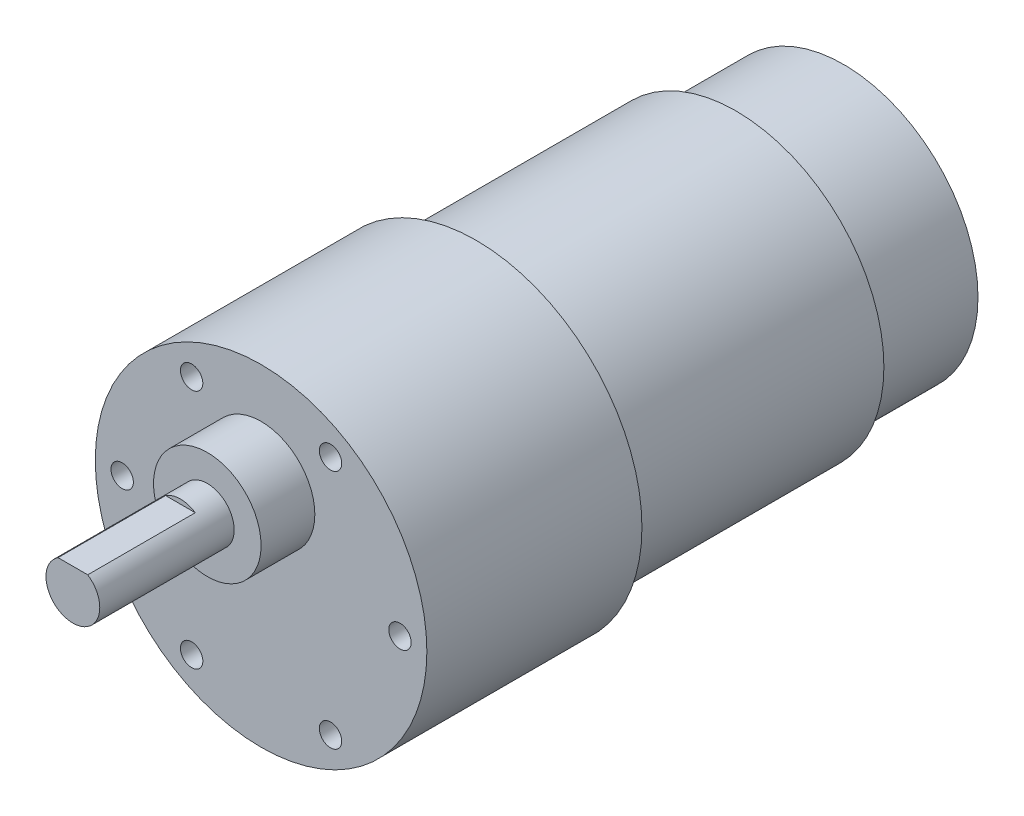
ISO-10303-21;
HEADER;
FILE_DESCRIPTION(('STEP AP214'),'2;1');
FILE_NAME('part.step','',(''),(''),'','','');
FILE_SCHEMA(('AUTOMOTIVE_DESIGN { 1 0 10303 214 1 1 1 1 }'));
ENDSEC;
DATA;
#1=APPLICATION_CONTEXT('core data for automotive mechanical design processes');
#2=APPLICATION_PROTOCOL_DEFINITION('international standard','automotive_design',2000,#1);
#3=PRODUCT_CONTEXT('',#1,'mechanical');
#4=PRODUCT('Part','Part','',(#3));
#5=PRODUCT_RELATED_PRODUCT_CATEGORY('part','',(#4));
#6=PRODUCT_DEFINITION_FORMATION('','',#4);
#7=PRODUCT_DEFINITION_CONTEXT('part definition',#1,'design');
#8=PRODUCT_DEFINITION('design','',#6,#7);
#9=PRODUCT_DEFINITION_SHAPE('','',#8);
#10=(LENGTH_UNIT() NAMED_UNIT(*) SI_UNIT(.MILLI.,.METRE.));
#11=(NAMED_UNIT(*) PLANE_ANGLE_UNIT() SI_UNIT($,.RADIAN.));
#12=(NAMED_UNIT(*) SI_UNIT($,.STERADIAN.) SOLID_ANGLE_UNIT());
#13=UNCERTAINTY_MEASURE_WITH_UNIT(LENGTH_MEASURE(1.E-05),#10,'distance_accuracy_value','');
#14=(GEOMETRIC_REPRESENTATION_CONTEXT(3) GLOBAL_UNCERTAINTY_ASSIGNED_CONTEXT((#13)) GLOBAL_UNIT_ASSIGNED_CONTEXT((#10,
#11,#12)) REPRESENTATION_CONTEXT('',''));
#15=CARTESIAN_POINT('',(0.,0.,0.));
#16=DIRECTION('',(0.,0.,1.));
#17=DIRECTION('',(1.,0.,0.));
#18=AXIS2_PLACEMENT_3D('',#15,#16,#17);
#19=CARTESIAN_POINT('',(0.,0.,21.));
#20=DIRECTION('',(0.,0.,-1.));
#21=DIRECTION('',(-1.,0.,0.));
#22=AXIS2_PLACEMENT_3D('',#19,#20,#21);
#23=CYLINDRICAL_SURFACE('',#22,3.);
#24=CARTESIAN_POINT('',(0.,0.,6.));
#25=DIRECTION('',(0.,0.,1.));
#26=DIRECTION('',(1.,0.,0.));
#27=AXIS2_PLACEMENT_3D('',#24,#25,#26);
#28=CIRCLE('',#27,3.);
#29=CARTESIAN_POINT('',(3.,0.,6.));
#30=VERTEX_POINT('',#29);
#31=EDGE_CURVE('E83',#30,#30,#28,.T.);
#32=ORIENTED_EDGE('',*,*,#31,.T.);
#33=EDGE_LOOP('',(#32));
#34=FACE_BOUND('',#33,.T.);
#35=DIRECTION('',(0.,0.,-1.));
#36=VECTOR('',#35,1.);
#37=CARTESIAN_POINT('',(1.6583123951777,2.5,21.));
#38=LINE('',#37,#36);
#39=CARTESIAN_POINT('',(1.6583123951777,2.5,21.));
#40=VERTEX_POINT('',#39);
#41=CARTESIAN_POINT('',(1.6583123951777,2.5,9.));
#42=VERTEX_POINT('',#41);
#43=EDGE_CURVE('E73',#40,#42,#38,.T.);
#44=ORIENTED_EDGE('',*,*,#43,.F.);
#45=CARTESIAN_POINT('',(0.,0.,21.));
#46=DIRECTION('',(0.,0.,1.));
#47=DIRECTION('',(1.,0.,0.));
#48=AXIS2_PLACEMENT_3D('',#45,#46,#47);
#49=CIRCLE('',#48,3.);
#50=CARTESIAN_POINT('',(-1.6583123951777,2.5,21.));
#51=VERTEX_POINT('',#50);
#52=EDGE_CURVE('E77',#51,#40,#49,.T.);
#53=ORIENTED_EDGE('',*,*,#52,.F.);
#54=DIRECTION('',(0.,0.,-1.));
#55=VECTOR('',#54,1.);
#56=CARTESIAN_POINT('',(-1.6583123951777,2.5,21.));
#57=LINE('',#56,#55);
#58=CARTESIAN_POINT('',(-1.6583123951777,2.5,9.));
#59=VERTEX_POINT('',#58);
#60=EDGE_CURVE('E58',#59,#51,#57,.F.);
#61=ORIENTED_EDGE('',*,*,#60,.F.);
#62=CARTESIAN_POINT('',(0.,0.,9.));
#63=DIRECTION('',(0.,0.,1.));
#64=DIRECTION('',(1.,0.,0.));
#65=AXIS2_PLACEMENT_3D('',#62,#63,#64);
#66=CIRCLE('',#65,3.);
#67=EDGE_CURVE('E11',#42,#59,#66,.T.);
#68=ORIENTED_EDGE('',*,*,#67,.F.);
#69=EDGE_LOOP('',(#44,#53,#61,#68));
#70=FACE_BOUND('',#69,.T.);
#71=ADVANCED_FACE('F43',(#34,#70),#23,.T.);
#72=CARTESIAN_POINT('',(0.,0.,21.));
#73=DIRECTION('',(0.,0.,1.));
#74=DIRECTION('',(1.,0.,0.));
#75=AXIS2_PLACEMENT_3D('',#72,#73,#74);
#76=PLANE('',#75);
#77=ORIENTED_EDGE('',*,*,#52,.T.);
#78=DIRECTION('',(-1.,0.,0.));
#79=VECTOR('',#78,1.);
#80=CARTESIAN_POINT('',(0.,2.5,21.));
#81=LINE('',#80,#79);
#82=EDGE_CURVE('E51',#40,#51,#81,.T.);
#83=ORIENTED_EDGE('',*,*,#82,.T.);
#84=EDGE_LOOP('',(#77,#83));
#85=FACE_BOUND('',#84,.T.);
#86=ADVANCED_FACE('F145',(#85),#76,.T.);
#87=CARTESIAN_POINT('',(0.,-7.,0.));
#88=DIRECTION('',(0.,0.,-1.));
#89=DIRECTION('',(-1.,0.,0.));
#90=AXIS2_PLACEMENT_3D('',#87,#88,#89);
#91=CYLINDRICAL_SURFACE('',#90,18.5);
#92=CARTESIAN_POINT('',(0.,-7.,0.));
#93=DIRECTION('',(0.,0.,1.));
#94=DIRECTION('',(1.,0.,0.));
#95=AXIS2_PLACEMENT_3D('',#92,#93,#94);
#96=CIRCLE('',#95,18.5);
#97=CARTESIAN_POINT('',(18.5,-7.,0.));
#98=VERTEX_POINT('',#97);
#99=EDGE_CURVE('E86',#98,#98,#96,.T.);
#100=ORIENTED_EDGE('',*,*,#99,.F.);
#101=EDGE_LOOP('',(#100));
#102=FACE_BOUND('',#101,.T.);
#103=CARTESIAN_POINT('',(0.,-7.,-24.));
#104=DIRECTION('',(0.,0.,1.));
#105=DIRECTION('',(1.,0.,0.));
#106=AXIS2_PLACEMENT_3D('',#103,#104,#105);
#107=CIRCLE('',#106,18.5);
#108=CARTESIAN_POINT('',(18.5,-7.,-24.));
#109=VERTEX_POINT('',#108);
#110=EDGE_CURVE('E125',#109,#109,#107,.T.);
#111=ORIENTED_EDGE('',*,*,#110,.T.);
#112=EDGE_LOOP('',(#111));
#113=FACE_BOUND('',#112,.T.);
#114=ADVANCED_FACE('F45',(#102,#113),#91,.T.);
#115=CARTESIAN_POINT('',(0.,-7.,0.));
#116=DIRECTION('',(0.,0.,1.));
#117=DIRECTION('',(1.,0.,0.));
#118=AXIS2_PLACEMENT_3D('',#115,#116,#117);
#119=PLANE('',#118);
#120=CARTESIAN_POINT('',(0.,0.,0.));
#121=DIRECTION('',(0.,0.,1.));
#122=DIRECTION('',(1.,0.,0.));
#123=AXIS2_PLACEMENT_3D('',#120,#121,#122);
#124=CIRCLE('',#123,6.);
#125=CARTESIAN_POINT('',(6.,0.,0.));
#126=VERTEX_POINT('',#125);
#127=EDGE_CURVE('E82',#126,#126,#124,.T.);
#128=ORIENTED_EDGE('',*,*,#127,.F.);
#129=EDGE_LOOP('',(#128));
#130=FACE_BOUND('',#129,.T.);
#131=CARTESIAN_POINT('',(15.5,-7.,0.));
#132=DIRECTION('',(0.,0.,1.));
#133=DIRECTION('',(1.,0.,0.));
#134=AXIS2_PLACEMENT_3D('',#131,#132,#133);
#135=CIRCLE('',#134,1.25);
#136=CARTESIAN_POINT('',(16.75,-7.,0.));
#137=VERTEX_POINT('',#136);
#138=EDGE_CURVE('E128',#137,#137,#135,.F.);
#139=ORIENTED_EDGE('',*,*,#138,.T.);
#140=EDGE_LOOP('',(#139));
#141=FACE_BOUND('',#140,.T.);
#142=CARTESIAN_POINT('',(7.75,-20.4233937586588,0.));
#143=DIRECTION('',(0.,0.,1.));
#144=DIRECTION('',(1.,0.,0.));
#145=AXIS2_PLACEMENT_3D('',#142,#143,#144);
#146=CIRCLE('',#145,1.25);
#147=CARTESIAN_POINT('',(9.,-20.4233937586588,0.));
#148=VERTEX_POINT('',#147);
#149=EDGE_CURVE('E140',#148,#148,#146,.F.);
#150=ORIENTED_EDGE('',*,*,#149,.T.);
#151=EDGE_LOOP('',(#150));
#152=FACE_BOUND('',#151,.T.);
#153=CARTESIAN_POINT('',(-7.75000000000001,-20.4233937586588,0.));
#154=DIRECTION('',(0.,0.,1.));
#155=DIRECTION('',(1.,0.,0.));
#156=AXIS2_PLACEMENT_3D('',#153,#154,#155);
#157=CIRCLE('',#156,1.25);
#158=CARTESIAN_POINT('',(-6.50000000000001,-20.4233937586588,0.));
#159=VERTEX_POINT('',#158);
#160=EDGE_CURVE('E137',#159,#159,#157,.F.);
#161=ORIENTED_EDGE('',*,*,#160,.T.);
#162=EDGE_LOOP('',(#161));
#163=FACE_BOUND('',#162,.T.);
#164=CARTESIAN_POINT('',(-15.5,-7.,0.));
#165=DIRECTION('',(0.,0.,1.));
#166=DIRECTION('',(1.,0.,0.));
#167=AXIS2_PLACEMENT_3D('',#164,#165,#166);
#168=CIRCLE('',#167,1.25);
#169=CARTESIAN_POINT('',(-14.25,-7.,0.));
#170=VERTEX_POINT('',#169);
#171=EDGE_CURVE('E134',#170,#170,#168,.F.);
#172=ORIENTED_EDGE('',*,*,#171,.T.);
#173=EDGE_LOOP('',(#172));
#174=FACE_BOUND('',#173,.T.);
#175=CARTESIAN_POINT('',(-7.75,6.4233937586588,0.));
#176=DIRECTION('',(0.,0.,1.));
#177=DIRECTION('',(1.,0.,0.));
#178=AXIS2_PLACEMENT_3D('',#175,#176,#177);
#179=CIRCLE('',#178,1.25);
#180=CARTESIAN_POINT('',(-6.5,6.4233937586588,0.));
#181=VERTEX_POINT('',#180);
#182=EDGE_CURVE('E131',#181,#181,#179,.F.);
#183=ORIENTED_EDGE('',*,*,#182,.T.);
#184=EDGE_LOOP('',(#183));
#185=FACE_BOUND('',#184,.T.);
#186=CARTESIAN_POINT('',(7.75,6.4233937586588,0.));
#187=DIRECTION('',(0.,0.,1.));
#188=DIRECTION('',(1.,0.,0.));
#189=AXIS2_PLACEMENT_3D('',#186,#187,#188);
#190=CIRCLE('',#189,1.25);
#191=CARTESIAN_POINT('',(9.,6.4233937586588,0.));
#192=VERTEX_POINT('',#191);
#193=EDGE_CURVE('E108',#192,#192,#190,.F.);
#194=ORIENTED_EDGE('',*,*,#193,.T.);
#195=EDGE_LOOP('',(#194));
#196=FACE_BOUND('',#195,.T.);
#197=ORIENTED_EDGE('',*,*,#99,.T.);
#198=EDGE_LOOP('',(#197));
#199=FACE_BOUND('',#198,.T.);
#200=ADVANCED_FACE('F153',(#130,#141,#152,#163,#174,#185,#196,#199),#119,.T.);
#201=CARTESIAN_POINT('',(0.,-7.,-24.));
#202=DIRECTION('',(0.,0.,1.));
#203=DIRECTION('',(1.,0.,0.));
#204=AXIS2_PLACEMENT_3D('',#201,#202,#203);
#205=PLANE('',#204);
#206=CARTESIAN_POINT('',(0.,-7.,-24.));
#207=DIRECTION('',(0.,0.,1.));
#208=DIRECTION('',(1.,0.,0.));
#209=AXIS2_PLACEMENT_3D('',#206,#207,#208);
#210=CIRCLE('',#209,16.5);
#211=CARTESIAN_POINT('',(-16.5,-7.,-24.));
#212=VERTEX_POINT('',#211);
#213=EDGE_CURVE('E99',#212,#212,#210,.T.);
#214=ORIENTED_EDGE('',*,*,#213,.T.);
#215=EDGE_LOOP('',(#214));
#216=FACE_BOUND('',#215,.T.);
#217=ORIENTED_EDGE('',*,*,#110,.F.);
#218=EDGE_LOOP('',(#217));
#219=FACE_BOUND('',#218,.T.);
#220=ADVANCED_FACE('F205',(#216,#219),#205,.F.);
#221=CARTESIAN_POINT('',(7.75,6.4233937586588,0.00999999999999959));
#222=DIRECTION('',(0.,0.,-1.));
#223=DIRECTION('',(-1.,0.,0.));
#224=AXIS2_PLACEMENT_3D('',#221,#222,#223);
#225=CYLINDRICAL_SURFACE('',#224,1.25);
#226=ORIENTED_EDGE('',*,*,#193,.F.);
#227=EDGE_LOOP('',(#226));
#228=FACE_BOUND('',#227,.T.);
#229=CARTESIAN_POINT('',(7.75,6.4233937586588,-3.5));
#230=DIRECTION('',(0.,0.,1.));
#231=DIRECTION('',(1.,0.,0.));
#232=AXIS2_PLACEMENT_3D('',#229,#230,#231);
#233=CIRCLE('',#232,1.25);
#234=CARTESIAN_POINT('',(9.,6.4233937586588,-3.5));
#235=VERTEX_POINT('',#234);
#236=EDGE_CURVE('E109',#235,#235,#233,.T.);
#237=ORIENTED_EDGE('',*,*,#236,.F.);
#238=EDGE_LOOP('',(#237));
#239=FACE_BOUND('',#238,.T.);
#240=ADVANCED_FACE('F201',(#228,#239),#225,.F.);
#241=CARTESIAN_POINT('',(7.75,6.4233937586588,-3.5));
#242=DIRECTION('',(0.,0.,1.));
#243=DIRECTION('',(1.,0.,0.));
#244=AXIS2_PLACEMENT_3D('',#241,#242,#243);
#245=PLANE('',#244);
#246=ORIENTED_EDGE('',*,*,#236,.T.);
#247=EDGE_LOOP('',(#246));
#248=FACE_BOUND('',#247,.T.);
#249=ADVANCED_FACE('F204',(#248),#245,.T.);
#250=CARTESIAN_POINT('',(-7.75,6.4233937586588,0.00999999999999959));
#251=DIRECTION('',(0.,0.,-1.));
#252=DIRECTION('',(-1.,0.,0.));
#253=AXIS2_PLACEMENT_3D('',#250,#251,#252);
#254=CYLINDRICAL_SURFACE('',#253,1.25);
#255=ORIENTED_EDGE('',*,*,#182,.F.);
#256=EDGE_LOOP('',(#255));
#257=FACE_BOUND('',#256,.T.);
#258=CARTESIAN_POINT('',(-7.75,6.4233937586588,-3.5));
#259=DIRECTION('',(0.,0.,1.));
#260=DIRECTION('',(1.,0.,0.));
#261=AXIS2_PLACEMENT_3D('',#258,#259,#260);
#262=CIRCLE('',#261,1.25);
#263=CARTESIAN_POINT('',(-6.5,6.4233937586588,-3.5));
#264=VERTEX_POINT('',#263);
#265=EDGE_CURVE('E115',#264,#264,#262,.T.);
#266=ORIENTED_EDGE('',*,*,#265,.F.);
#267=EDGE_LOOP('',(#266));
#268=FACE_BOUND('',#267,.T.);
#269=ADVANCED_FACE('F209',(#257,#268),#254,.F.);
#270=CARTESIAN_POINT('',(-7.75,6.4233937586588,-3.5));
#271=DIRECTION('',(0.,0.,1.));
#272=DIRECTION('',(1.,0.,0.));
#273=AXIS2_PLACEMENT_3D('',#270,#271,#272);
#274=PLANE('',#273);
#275=ORIENTED_EDGE('',*,*,#265,.T.);
#276=EDGE_LOOP('',(#275));
#277=FACE_BOUND('',#276,.T.);
#278=ADVANCED_FACE('F213',(#277),#274,.T.);
#279=CARTESIAN_POINT('',(-15.5,-7.,0.00999999999999959));
#280=DIRECTION('',(0.,0.,-1.));
#281=DIRECTION('',(-1.,0.,0.));
#282=AXIS2_PLACEMENT_3D('',#279,#280,#281);
#283=CYLINDRICAL_SURFACE('',#282,1.25);
#284=ORIENTED_EDGE('',*,*,#171,.F.);
#285=EDGE_LOOP('',(#284));
#286=FACE_BOUND('',#285,.T.);
#287=CARTESIAN_POINT('',(-15.5,-7.,-3.5));
#288=DIRECTION('',(0.,0.,1.));
#289=DIRECTION('',(1.,0.,0.));
#290=AXIS2_PLACEMENT_3D('',#287,#288,#289);
#291=CIRCLE('',#290,1.25);
#292=CARTESIAN_POINT('',(-14.25,-7.,-3.5));
#293=VERTEX_POINT('',#292);
#294=EDGE_CURVE('E118',#293,#293,#291,.T.);
#295=ORIENTED_EDGE('',*,*,#294,.F.);
#296=EDGE_LOOP('',(#295));
#297=FACE_BOUND('',#296,.T.);
#298=ADVANCED_FACE('F217',(#286,#297),#283,.F.);
#299=CARTESIAN_POINT('',(-15.5,-7.,-3.5));
#300=DIRECTION('',(0.,0.,1.));
#301=DIRECTION('',(1.,0.,0.));
#302=AXIS2_PLACEMENT_3D('',#299,#300,#301);
#303=PLANE('',#302);
#304=ORIENTED_EDGE('',*,*,#294,.T.);
#305=EDGE_LOOP('',(#304));
#306=FACE_BOUND('',#305,.T.);
#307=ADVANCED_FACE('F221',(#306),#303,.T.);
#308=CARTESIAN_POINT('',(-7.75000000000001,-20.4233937586588,0.00999999999999959));
#309=DIRECTION('',(0.,0.,-1.));
#310=DIRECTION('',(-1.,0.,0.));
#311=AXIS2_PLACEMENT_3D('',#308,#309,#310);
#312=CYLINDRICAL_SURFACE('',#311,1.25);
#313=ORIENTED_EDGE('',*,*,#160,.F.);
#314=EDGE_LOOP('',(#313));
#315=FACE_BOUND('',#314,.T.);
#316=CARTESIAN_POINT('',(-7.75000000000001,-20.4233937586588,-3.5));
#317=DIRECTION('',(0.,0.,1.));
#318=DIRECTION('',(1.,0.,0.));
#319=AXIS2_PLACEMENT_3D('',#316,#317,#318);
#320=CIRCLE('',#319,1.25);
#321=CARTESIAN_POINT('',(-6.50000000000001,-20.4233937586588,-3.5));
#322=VERTEX_POINT('',#321);
#323=EDGE_CURVE('E112',#322,#322,#320,.T.);
#324=ORIENTED_EDGE('',*,*,#323,.F.);
#325=EDGE_LOOP('',(#324));
#326=FACE_BOUND('',#325,.T.);
#327=ADVANCED_FACE('F225',(#315,#326),#312,.F.);
#328=CARTESIAN_POINT('',(-7.75000000000001,-20.4233937586588,-3.5));
#329=DIRECTION('',(0.,0.,1.));
#330=DIRECTION('',(1.,0.,0.));
#331=AXIS2_PLACEMENT_3D('',#328,#329,#330);
#332=PLANE('',#331);
#333=ORIENTED_EDGE('',*,*,#323,.T.);
#334=EDGE_LOOP('',(#333));
#335=FACE_BOUND('',#334,.T.);
#336=ADVANCED_FACE('F196',(#335),#332,.T.);
#337=CARTESIAN_POINT('',(7.75,-20.4233937586588,0.00999999999999959));
#338=DIRECTION('',(0.,0.,-1.));
#339=DIRECTION('',(-1.,0.,0.));
#340=AXIS2_PLACEMENT_3D('',#337,#338,#339);
#341=CYLINDRICAL_SURFACE('',#340,1.25);
#342=ORIENTED_EDGE('',*,*,#149,.F.);
#343=EDGE_LOOP('',(#342));
#344=FACE_BOUND('',#343,.T.);
#345=CARTESIAN_POINT('',(7.75,-20.4233937586588,-3.5));
#346=DIRECTION('',(0.,0.,1.));
#347=DIRECTION('',(1.,0.,0.));
#348=AXIS2_PLACEMENT_3D('',#345,#346,#347);
#349=CIRCLE('',#348,1.25);
#350=CARTESIAN_POINT('',(9.,-20.4233937586588,-3.5));
#351=VERTEX_POINT('',#350);
#352=EDGE_CURVE('E102',#351,#351,#349,.T.);
#353=ORIENTED_EDGE('',*,*,#352,.F.);
#354=EDGE_LOOP('',(#353));
#355=FACE_BOUND('',#354,.T.);
#356=ADVANCED_FACE('F193',(#344,#355),#341,.F.);
#357=CARTESIAN_POINT('',(7.75,-20.4233937586588,-3.5));
#358=DIRECTION('',(0.,0.,1.));
#359=DIRECTION('',(1.,0.,0.));
#360=AXIS2_PLACEMENT_3D('',#357,#358,#359);
#361=PLANE('',#360);
#362=ORIENTED_EDGE('',*,*,#352,.T.);
#363=EDGE_LOOP('',(#362));
#364=FACE_BOUND('',#363,.T.);
#365=ADVANCED_FACE('F191',(#364),#361,.T.);
#366=CARTESIAN_POINT('',(15.5,-7.,0.00999999999999959));
#367=DIRECTION('',(0.,0.,-1.));
#368=DIRECTION('',(-1.,0.,0.));
#369=AXIS2_PLACEMENT_3D('',#366,#367,#368);
#370=CYLINDRICAL_SURFACE('',#369,1.25);
#371=ORIENTED_EDGE('',*,*,#138,.F.);
#372=EDGE_LOOP('',(#371));
#373=FACE_BOUND('',#372,.T.);
#374=CARTESIAN_POINT('',(15.5,-7.,-3.5));
#375=DIRECTION('',(0.,0.,1.));
#376=DIRECTION('',(1.,0.,0.));
#377=AXIS2_PLACEMENT_3D('',#374,#375,#376);
#378=CIRCLE('',#377,1.25);
#379=CARTESIAN_POINT('',(16.75,-7.,-3.5));
#380=VERTEX_POINT('',#379);
#381=EDGE_CURVE('E105',#380,#380,#378,.T.);
#382=ORIENTED_EDGE('',*,*,#381,.F.);
#383=EDGE_LOOP('',(#382));
#384=FACE_BOUND('',#383,.T.);
#385=ADVANCED_FACE('F187',(#373,#384),#370,.F.);
#386=CARTESIAN_POINT('',(15.5,-7.,-3.5));
#387=DIRECTION('',(0.,0.,1.));
#388=DIRECTION('',(1.,0.,0.));
#389=AXIS2_PLACEMENT_3D('',#386,#387,#388);
#390=PLANE('',#389);
#391=ORIENTED_EDGE('',*,*,#381,.T.);
#392=EDGE_LOOP('',(#391));
#393=FACE_BOUND('',#392,.T.);
#394=ADVANCED_FACE('F183',(#393),#390,.T.);
#395=CARTESIAN_POINT('',(0.,-7.,-24.));
#396=DIRECTION('',(0.,0.,-1.));
#397=DIRECTION('',(-1.,0.,0.));
#398=AXIS2_PLACEMENT_3D('',#395,#396,#397);
#399=CYLINDRICAL_SURFACE('',#398,16.5);
#400=CARTESIAN_POINT('',(0.,-7.,-53.));
#401=DIRECTION('',(0.,0.,1.));
#402=DIRECTION('',(1.,0.,0.));
#403=AXIS2_PLACEMENT_3D('',#400,#401,#402);
#404=CIRCLE('',#403,16.5);
#405=CARTESIAN_POINT('',(-16.5,-7.,-53.));
#406=VERTEX_POINT('',#405);
#407=EDGE_CURVE('E96',#406,#406,#404,.T.);
#408=CARTESIAN_POINT('',(-16.5,-7.,-24.));
#409=CARTESIAN_POINT('',(-16.5,-7.,-24.3020833333333));
#410=CARTESIAN_POINT('',(-16.5,-7.,-24.6041666666667));
#411=CARTESIAN_POINT('',(-16.5,-7.,-25.2083333333333));
#412=CARTESIAN_POINT('',(-16.5,-7.,-25.5104166666667));
#413=CARTESIAN_POINT('',(-16.5,-7.,-26.1145833333333));
#414=CARTESIAN_POINT('',(-16.5,-7.,-26.4166666666667));
#415=CARTESIAN_POINT('',(-16.5,-7.,-27.0208333333333));
#416=CARTESIAN_POINT('',(-16.5,-7.,-27.3229166666667));
#417=CARTESIAN_POINT('',(-16.5,-7.,-27.9270833333333));
#418=CARTESIAN_POINT('',(-16.5,-7.,-28.2291666666667));
#419=CARTESIAN_POINT('',(-16.5,-7.,-28.8333333333333));
#420=CARTESIAN_POINT('',(-16.5,-7.,-29.1354166666667));
#421=CARTESIAN_POINT('',(-16.5,-7.,-29.7395833333333));
#422=CARTESIAN_POINT('',(-16.5,-7.,-30.0416666666667));
#423=CARTESIAN_POINT('',(-16.5,-7.,-30.6458333333333));
#424=CARTESIAN_POINT('',(-16.5,-7.,-30.9479166666667));
#425=CARTESIAN_POINT('',(-16.5,-7.,-31.5520833333333));
#426=CARTESIAN_POINT('',(-16.5,-7.,-31.8541666666667));
#427=CARTESIAN_POINT('',(-16.5,-7.,-32.4583333333333));
#428=CARTESIAN_POINT('',(-16.5,-7.,-32.7604166666667));
#429=CARTESIAN_POINT('',(-16.5,-7.,-33.3645833333333));
#430=CARTESIAN_POINT('',(-16.5,-7.,-33.6666666666667));
#431=CARTESIAN_POINT('',(-16.5,-7.,-34.2708333333333));
#432=CARTESIAN_POINT('',(-16.5,-7.,-34.5729166666667));
#433=CARTESIAN_POINT('',(-16.5,-7.,-35.1770833333333));
#434=CARTESIAN_POINT('',(-16.5,-7.,-35.4791666666667));
#435=CARTESIAN_POINT('',(-16.5,-7.,-36.0833333333333));
#436=CARTESIAN_POINT('',(-16.5,-7.,-36.3854166666667));
#437=CARTESIAN_POINT('',(-16.5,-7.,-36.9895833333333));
#438=CARTESIAN_POINT('',(-16.5,-7.,-37.2916666666667));
#439=CARTESIAN_POINT('',(-16.5,-7.,-37.8958333333333));
#440=CARTESIAN_POINT('',(-16.5,-7.,-38.1979166666667));
#441=CARTESIAN_POINT('',(-16.5,-7.,-38.8020833333333));
#442=CARTESIAN_POINT('',(-16.5,-7.,-39.1041666666667));
#443=CARTESIAN_POINT('',(-16.5,-7.,-39.7083333333333));
#444=CARTESIAN_POINT('',(-16.5,-7.,-40.0104166666667));
#445=CARTESIAN_POINT('',(-16.5,-7.,-40.6145833333333));
#446=CARTESIAN_POINT('',(-16.5,-7.,-40.9166666666667));
#447=CARTESIAN_POINT('',(-16.5,-7.,-41.5208333333333));
#448=CARTESIAN_POINT('',(-16.5,-7.,-41.8229166666667));
#449=CARTESIAN_POINT('',(-16.5,-7.,-42.4270833333333));
#450=CARTESIAN_POINT('',(-16.5,-7.,-42.7291666666667));
#451=CARTESIAN_POINT('',(-16.5,-7.,-43.3333333333333));
#452=CARTESIAN_POINT('',(-16.5,-7.,-43.6354166666667));
#453=CARTESIAN_POINT('',(-16.5,-7.,-44.2395833333333));
#454=CARTESIAN_POINT('',(-16.5,-7.,-44.5416666666667));
#455=CARTESIAN_POINT('',(-16.5,-7.,-45.1458333333333));
#456=CARTESIAN_POINT('',(-16.5,-7.,-45.4479166666667));
#457=CARTESIAN_POINT('',(-16.5,-7.,-46.0520833333333));
#458=CARTESIAN_POINT('',(-16.5,-7.,-46.3541666666667));
#459=CARTESIAN_POINT('',(-16.5,-7.,-46.9583333333333));
#460=CARTESIAN_POINT('',(-16.5,-7.,-47.2604166666667));
#461=CARTESIAN_POINT('',(-16.5,-7.,-47.8645833333333));
#462=CARTESIAN_POINT('',(-16.5,-7.,-48.1666666666667));
#463=CARTESIAN_POINT('',(-16.5,-7.,-48.7708333333333));
#464=CARTESIAN_POINT('',(-16.5,-7.,-49.0729166666667));
#465=CARTESIAN_POINT('',(-16.5,-7.,-49.6770833333333));
#466=CARTESIAN_POINT('',(-16.5,-7.,-49.9791666666667));
#467=CARTESIAN_POINT('',(-16.5,-7.,-50.5833333333333));
#468=CARTESIAN_POINT('',(-16.5,-7.,-50.8854166666667));
#469=CARTESIAN_POINT('',(-16.5,-7.,-51.4895833333333));
#470=CARTESIAN_POINT('',(-16.5,-7.,-51.7916666666667));
#471=CARTESIAN_POINT('',(-16.5,-7.,-52.3958333333333));
#472=CARTESIAN_POINT('',(-16.5,-7.,-52.6979166666667));
#473=CARTESIAN_POINT('',(-16.5,-7.,-53.));
#474=B_SPLINE_CURVE_WITH_KNOTS('',3,(#408,#409,#410,#411,#412,#413,#414,#415,#416,#417,#418,
#419,#420,#421,#422,#423,#424,#425,#426,#427,#428,#429,#430,#431,#432,#433,#434,#435,#436,#437,
#438,#439,#440,#441,#442,#443,#444,#445,#446,#447,#448,#449,#450,#451,#452,#453,#454,#455,#456,
#457,#458,#459,#460,#461,#462,#463,#464,#465,#466,#467,#468,#469,#470,#471,#472,#473),
.UNSPECIFIED.,.F.,.F.,(4,2,2,2,2,2,2,2,2,2,2,2,2,2,2,2,2,2,2,2,2,2,2,2,2,2,2,2,2,2,2,2,4),(0.,
0.906250000000001,1.8125,2.71875,3.625,4.53125,5.4375,6.34375,7.25,8.15625,9.0625,9.96875,
10.875,11.78125,12.6875,13.59375,14.5,15.40625,16.3125,17.21875,18.125,19.03125,19.9375,
20.84375,21.75,22.65625,23.5625,24.46875,25.375,26.28125,27.1875,28.09375,29.),.UNSPECIFIED.);
#475=EDGE_CURVE('BSEAM179',#212,#406,#474,.T.);
#476=ORIENTED_EDGE('',*,*,#213,.F.);
#477=ORIENTED_EDGE('',*,*,#407,.T.);
#478=ORIENTED_EDGE('',*,*,#475,.T.);
#479=ORIENTED_EDGE('',*,*,#475,.F.);
#480=EDGE_LOOP('',(#476,#478,#477,#479));
#481=FACE_BOUND('',#480,.T.);
#482=ADVANCED_FACE('F179',(#481),#399,.T.);
#483=CARTESIAN_POINT('',(0.,-7.,-53.));
#484=DIRECTION('',(0.,0.,1.));
#485=DIRECTION('',(1.,0.,0.));
#486=AXIS2_PLACEMENT_3D('',#483,#484,#485);
#487=PLANE('',#486);
#488=CARTESIAN_POINT('',(0.,-7.,-53.));
#489=DIRECTION('',(0.,0.,1.));
#490=DIRECTION('',(1.,0.,0.));
#491=AXIS2_PLACEMENT_3D('',#488,#489,#490);
#492=CIRCLE('',#491,15.);
#493=CARTESIAN_POINT('',(15.,-7.,-53.));
#494=VERTEX_POINT('',#493);
#495=EDGE_CURVE('E93',#494,#494,#492,.T.);
#496=ORIENTED_EDGE('',*,*,#495,.T.);
#497=EDGE_LOOP('',(#496));
#498=FACE_BOUND('',#497,.T.);
#499=ORIENTED_EDGE('',*,*,#407,.F.);
#500=EDGE_LOOP('',(#499));
#501=FACE_BOUND('',#500,.T.);
#502=ADVANCED_FACE('F175',(#498,#501),#487,.F.);
#503=CARTESIAN_POINT('',(0.,-7.,-53.));
#504=DIRECTION('',(0.,0.,-1.));
#505=DIRECTION('',(-1.,0.,0.));
#506=AXIS2_PLACEMENT_3D('',#503,#504,#505);
#507=CYLINDRICAL_SURFACE('',#506,15.);
#508=ORIENTED_EDGE('',*,*,#495,.F.);
#509=EDGE_LOOP('',(#508));
#510=FACE_BOUND('',#509,.T.);
#511=CARTESIAN_POINT('',(0.,-7.,-65.));
#512=DIRECTION('',(0.,0.,1.));
#513=DIRECTION('',(1.,0.,0.));
#514=AXIS2_PLACEMENT_3D('',#511,#512,#513);
#515=CIRCLE('',#514,15.);
#516=CARTESIAN_POINT('',(15.,-7.,-65.));
#517=VERTEX_POINT('',#516);
#518=EDGE_CURVE('E90',#517,#517,#515,.T.);
#519=ORIENTED_EDGE('',*,*,#518,.T.);
#520=EDGE_LOOP('',(#519));
#521=FACE_BOUND('',#520,.T.);
#522=ADVANCED_FACE('F171',(#510,#521),#507,.T.);
#523=CARTESIAN_POINT('',(0.,-7.,-65.));
#524=DIRECTION('',(0.,0.,1.));
#525=DIRECTION('',(1.,0.,0.));
#526=AXIS2_PLACEMENT_3D('',#523,#524,#525);
#527=PLANE('',#526);
#528=ORIENTED_EDGE('',*,*,#518,.F.);
#529=EDGE_LOOP('',(#528));
#530=FACE_BOUND('',#529,.T.);
#531=ADVANCED_FACE('F167',(#530),#527,.F.);
#532=CARTESIAN_POINT('',(0.,0.,6.));
#533=DIRECTION('',(0.,0.,-1.));
#534=DIRECTION('',(-1.,0.,0.));
#535=AXIS2_PLACEMENT_3D('',#532,#533,#534);
#536=CYLINDRICAL_SURFACE('',#535,6.);
#537=CARTESIAN_POINT('',(0.,0.,6.));
#538=DIRECTION('',(0.,0.,1.));
#539=DIRECTION('',(1.,0.,0.));
#540=AXIS2_PLACEMENT_3D('',#537,#538,#539);
#541=CIRCLE('',#540,6.);
#542=CARTESIAN_POINT('',(6.,0.,6.));
#543=VERTEX_POINT('',#542);
#544=EDGE_CURVE('E87',#543,#543,#541,.T.);
#545=ORIENTED_EDGE('',*,*,#544,.F.);
#546=EDGE_LOOP('',(#545));
#547=FACE_BOUND('',#546,.T.);
#548=ORIENTED_EDGE('',*,*,#127,.T.);
#549=EDGE_LOOP('',(#548));
#550=FACE_BOUND('',#549,.T.);
#551=ADVANCED_FACE('F163',(#547,#550),#536,.T.);
#552=CARTESIAN_POINT('',(0.,0.,6.));
#553=DIRECTION('',(0.,0.,1.));
#554=DIRECTION('',(1.,0.,0.));
#555=AXIS2_PLACEMENT_3D('',#552,#553,#554);
#556=PLANE('',#555);
#557=ORIENTED_EDGE('',*,*,#31,.F.);
#558=EDGE_LOOP('',(#557));
#559=FACE_BOUND('',#558,.T.);
#560=ORIENTED_EDGE('',*,*,#544,.T.);
#561=EDGE_LOOP('',(#560));
#562=FACE_BOUND('',#561,.T.);
#563=ADVANCED_FACE('F160',(#559,#562),#556,.T.);
#564=CARTESIAN_POINT('',(0.,0.,9.));
#565=DIRECTION('',(0.,0.,1.));
#566=DIRECTION('',(1.,0.,0.));
#567=AXIS2_PLACEMENT_3D('',#564,#565,#566);
#568=PLANE('',#567);
#569=ORIENTED_EDGE('',*,*,#67,.T.);
#570=DIRECTION('',(1.,0.,0.));
#571=VECTOR('',#570,1.);
#572=CARTESIAN_POINT('',(-4.,2.5,9.));
#573=LINE('',#572,#571);
#574=EDGE_CURVE('E70',#59,#42,#573,.T.);
#575=ORIENTED_EDGE('',*,*,#574,.T.);
#576=EDGE_LOOP('',(#569,#575));
#577=FACE_BOUND('',#576,.T.);
#578=ADVANCED_FACE('F69',(#577),#568,.T.);
#579=CARTESIAN_POINT('',(-4.,2.5,21.01));
#580=DIRECTION('',(0.,1.,0.));
#581=DIRECTION('',(0.,0.,1.));
#582=AXIS2_PLACEMENT_3D('',#579,#580,#581);
#583=PLANE('',#582);
#584=ORIENTED_EDGE('',*,*,#43,.T.);
#585=ORIENTED_EDGE('',*,*,#574,.F.);
#586=ORIENTED_EDGE('',*,*,#60,.T.);
#587=ORIENTED_EDGE('',*,*,#82,.F.);
#588=EDGE_LOOP('',(#584,#585,#586,#587));
#589=FACE_BOUND('',#588,.T.);
#590=ADVANCED_FACE('F72',(#589),#583,.T.);
#591=CLOSED_SHELL('',(#71,#86,#114,#200,#220,#240,#249,#269,#278,#298,#307,#327,#336,#356,#365,
#385,#394,#482,#502,#522,#531,#551,#563,#578,#590));
#592=MANIFOLD_SOLID_BREP('B2',#591);
#593=ADVANCED_BREP_SHAPE_REPRESENTATION('',(#18,#592),#14);
#594=SHAPE_DEFINITION_REPRESENTATION(#9,#593);
ENDSEC;
END-ISO-10303-21;
